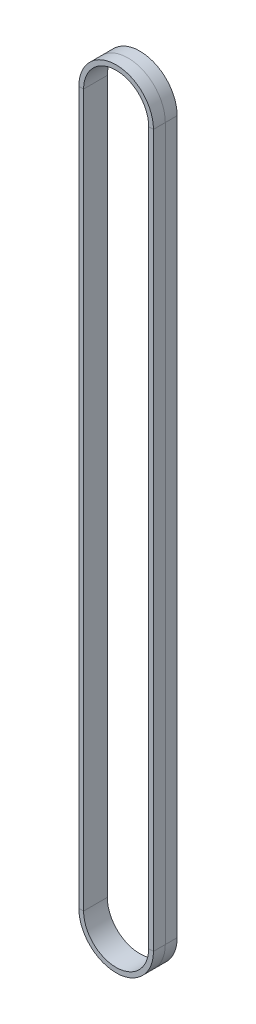
ISO-10303-21;
HEADER;
FILE_DESCRIPTION(('STEP AP214'),'2;1');
FILE_NAME('part.step','',(''),(''),'','','');
FILE_SCHEMA(('AUTOMOTIVE_DESIGN { 1 0 10303 214 1 1 1 1 }'));
ENDSEC;
DATA;
#1=APPLICATION_CONTEXT('core data for automotive mechanical design processes');
#2=APPLICATION_PROTOCOL_DEFINITION('international standard','automotive_design',2000,#1);
#3=PRODUCT_CONTEXT('',#1,'mechanical');
#4=PRODUCT('Part','Part','',(#3));
#5=PRODUCT_RELATED_PRODUCT_CATEGORY('part','',(#4));
#6=PRODUCT_DEFINITION_FORMATION('','',#4);
#7=PRODUCT_DEFINITION_CONTEXT('part definition',#1,'design');
#8=PRODUCT_DEFINITION('design','',#6,#7);
#9=PRODUCT_DEFINITION_SHAPE('','',#8);
#10=(LENGTH_UNIT() NAMED_UNIT(*) SI_UNIT(.MILLI.,.METRE.));
#11=(NAMED_UNIT(*) PLANE_ANGLE_UNIT() SI_UNIT($,.RADIAN.));
#12=(NAMED_UNIT(*) SI_UNIT($,.STERADIAN.) SOLID_ANGLE_UNIT());
#13=UNCERTAINTY_MEASURE_WITH_UNIT(LENGTH_MEASURE(1.E-05),#10,'distance_accuracy_value','');
#14=(GEOMETRIC_REPRESENTATION_CONTEXT(3) GLOBAL_UNCERTAINTY_ASSIGNED_CONTEXT((#13)) GLOBAL_UNIT_ASSIGNED_CONTEXT((#10,
#11,#12)) REPRESENTATION_CONTEXT('',''));
#15=CARTESIAN_POINT('',(0.,0.,0.));
#16=DIRECTION('',(0.,0.,1.));
#17=DIRECTION('',(1.,0.,0.));
#18=AXIS2_PLACEMENT_3D('',#15,#16,#17);
#19=CARTESIAN_POINT('',(-13.9450000000017,300.000000000021,-5.));
#20=DIRECTION('',(0.,0.,1.));
#21=DIRECTION('',(1.,0.,0.));
#22=AXIS2_PLACEMENT_3D('',#19,#20,#21);
#23=PLANE('',#22);
#24=DIRECTION('',(-1.,0.,0.));
#25=VECTOR('',#24,1.);
#26=CARTESIAN_POINT('',(-13.9450000000017,300.000000000021,-5.));
#27=LINE('',#26,#25);
#28=CARTESIAN_POINT('',(-13.9450000000017,300.000000000021,-5.));
#29=VERTEX_POINT('',#28);
#30=CARTESIAN_POINT('',(-15.9450000000017,300.000000000021,-5.));
#31=VERTEX_POINT('',#30);
#32=EDGE_CURVE('E167',#29,#31,#27,.T.);
#33=ORIENTED_EDGE('',*,*,#32,.F.);
#34=DIRECTION('',(0.,-1.,0.));
#35=VECTOR('',#34,1.);
#36=CARTESIAN_POINT('',(-13.9450000000017,300.000000000021,-5.));
#37=LINE('',#36,#35);
#38=CARTESIAN_POINT('',(-13.945,0.,-5.));
#39=VERTEX_POINT('',#38);
#40=EDGE_CURVE('E166',#29,#39,#37,.T.);
#41=ORIENTED_EDGE('',*,*,#40,.T.);
#42=DIRECTION('',(-1.,0.,0.));
#43=VECTOR('',#42,1.);
#44=CARTESIAN_POINT('',(-13.945,0.,-5.));
#45=LINE('',#44,#43);
#46=CARTESIAN_POINT('',(-15.945,0.,-5.));
#47=VERTEX_POINT('',#46);
#48=EDGE_CURVE('E146',#39,#47,#45,.T.);
#49=ORIENTED_EDGE('',*,*,#48,.T.);
#50=DIRECTION('',(0.,-1.,0.));
#51=VECTOR('',#50,1.);
#52=CARTESIAN_POINT('',(-15.9450000000017,300.000000000021,-5.));
#53=LINE('',#52,#51);
#54=EDGE_CURVE('E171',#31,#47,#53,.T.);
#55=ORIENTED_EDGE('',*,*,#54,.F.);
#56=EDGE_LOOP('',(#33,#41,#49,#55));
#57=FACE_BOUND('',#56,.T.);
#58=ADVANCED_FACE('F34',(#57),#23,.F.);
#59=CARTESIAN_POINT('',(-13.945,0.,-5.));
#60=DIRECTION('',(0.,0.,1.));
#61=DIRECTION('',(1.,0.,0.));
#62=AXIS2_PLACEMENT_3D('',#59,#60,#61);
#63=PLANE('',#62);
#64=CARTESIAN_POINT('',(-29.6645400780617,2.91433543964104E-13,-5.));
#65=DIRECTION('',(0.,0.,-1.));
#66=DIRECTION('',(1.,0.,0.));
#67=AXIS2_PLACEMENT_3D('',#64,#65,#66);
#68=CIRCLE('',#67,13.7195400780617);
#69=CARTESIAN_POINT('',(-43.3840801561233,5.8118692884397E-13,-5.));
#70=VERTEX_POINT('',#69);
#71=EDGE_CURVE('E129',#47,#70,#68,.T.);
#72=ORIENTED_EDGE('',*,*,#71,.F.);
#73=ORIENTED_EDGE('',*,*,#48,.F.);
#74=CARTESIAN_POINT('',(-29.6645400780617,2.91433543964104E-13,-5.));
#75=DIRECTION('',(0.,0.,-1.));
#76=DIRECTION('',(1.,0.,0.));
#77=AXIS2_PLACEMENT_3D('',#74,#75,#76);
#78=CIRCLE('',#77,15.7195400780617);
#79=CARTESIAN_POINT('',(-45.3840801561233,5.80941999484141E-13,-5.));
#80=VERTEX_POINT('',#79);
#81=EDGE_CURVE('E151',#39,#80,#78,.T.);
#82=ORIENTED_EDGE('',*,*,#81,.T.);
#83=DIRECTION('',(1.,0.,0.));
#84=VECTOR('',#83,1.);
#85=CARTESIAN_POINT('',(-45.3840801561233,5.84792176372274E-13,-5.));
#86=LINE('',#85,#84);
#87=EDGE_CURVE('E163',#80,#70,#86,.T.);
#88=ORIENTED_EDGE('',*,*,#87,.T.);
#89=EDGE_LOOP('',(#72,#73,#82,#88));
#90=FACE_BOUND('',#89,.T.);
#91=ADVANCED_FACE('F150',(#90),#63,.F.);
#92=CARTESIAN_POINT('',(-29.6645400780617,2.91433543964104E-13,0.));
#93=DIRECTION('',(0.,0.,-1.));
#94=DIRECTION('',(-1.,0.,0.));
#95=AXIS2_PLACEMENT_3D('',#92,#93,#94);
#96=CYLINDRICAL_SURFACE('',#95,13.7195400780617);
#97=CARTESIAN_POINT('',(-29.6645400780617,2.91433543964104E-13,5.));
#98=DIRECTION('',(0.,0.,-1.));
#99=DIRECTION('',(1.,0.,0.));
#100=AXIS2_PLACEMENT_3D('',#97,#98,#99);
#101=CIRCLE('',#100,13.7195400780617);
#102=CARTESIAN_POINT('',(-15.945,0.,5.));
#103=VERTEX_POINT('',#102);
#104=CARTESIAN_POINT('',(-43.3840801561233,5.8118692884397E-13,5.));
#105=VERTEX_POINT('',#104);
#106=EDGE_CURVE('E122',#103,#105,#101,.T.);
#107=ORIENTED_EDGE('',*,*,#106,.F.);
#108=DIRECTION('',(0.,0.,1.));
#109=VECTOR('',#108,1.);
#110=CARTESIAN_POINT('',(-15.945,0.,-5.));
#111=LINE('',#110,#109);
#112=EDGE_CURVE('E153',#47,#103,#111,.T.);
#113=ORIENTED_EDGE('',*,*,#112,.F.);
#114=ORIENTED_EDGE('',*,*,#71,.T.);
#115=DIRECTION('',(0.,0.,1.));
#116=VECTOR('',#115,1.);
#117=CARTESIAN_POINT('',(-43.3840801561233,5.84547247012444E-13,-5.));
#118=LINE('',#117,#116);
#119=EDGE_CURVE('E229',#70,#105,#118,.T.);
#120=ORIENTED_EDGE('',*,*,#119,.T.);
#121=EDGE_LOOP('',(#107,#113,#114,#120));
#122=FACE_BOUND('',#121,.T.);
#123=ADVANCED_FACE('F251',(#122),#96,.F.);
#124=CARTESIAN_POINT('',(-15.945,0.,5.));
#125=DIRECTION('',(0.,0.,-1.));
#126=DIRECTION('',(-1.,0.,0.));
#127=AXIS2_PLACEMENT_3D('',#124,#125,#126);
#128=PLANE('',#127);
#129=CARTESIAN_POINT('',(-29.6645400780617,2.91433543964104E-13,5.));
#130=DIRECTION('',(0.,0.,-1.));
#131=DIRECTION('',(1.,0.,0.));
#132=AXIS2_PLACEMENT_3D('',#129,#130,#131);
#133=CIRCLE('',#132,15.7195400780617);
#134=CARTESIAN_POINT('',(-13.945,0.,5.));
#135=VERTEX_POINT('',#134);
#136=CARTESIAN_POINT('',(-45.3840801561233,5.80941999484141E-13,5.));
#137=VERTEX_POINT('',#136);
#138=EDGE_CURVE('E115',#135,#137,#133,.T.);
#139=ORIENTED_EDGE('',*,*,#138,.F.);
#140=DIRECTION('',(1.,0.,0.));
#141=VECTOR('',#140,1.);
#142=CARTESIAN_POINT('',(-15.945,0.,5.));
#143=LINE('',#142,#141);
#144=EDGE_CURVE('E177',#103,#135,#143,.T.);
#145=ORIENTED_EDGE('',*,*,#144,.F.);
#146=ORIENTED_EDGE('',*,*,#106,.T.);
#147=DIRECTION('',(-1.,0.,0.));
#148=VECTOR('',#147,1.);
#149=CARTESIAN_POINT('',(-43.3840801561233,5.84547247012444E-13,5.));
#150=LINE('',#149,#148);
#151=EDGE_CURVE('E213',#105,#137,#150,.T.);
#152=ORIENTED_EDGE('',*,*,#151,.T.);
#153=EDGE_LOOP('',(#139,#145,#146,#152));
#154=FACE_BOUND('',#153,.T.);
#155=ADVANCED_FACE('F253',(#154),#128,.F.);
#156=CARTESIAN_POINT('',(-29.6645400780617,2.91433543964104E-13,0.));
#157=DIRECTION('',(0.,0.,-1.));
#158=DIRECTION('',(-1.,0.,0.));
#159=AXIS2_PLACEMENT_3D('',#156,#157,#158);
#160=CYLINDRICAL_SURFACE('',#159,15.7195400780617);
#161=CARTESIAN_POINT('',(-29.6645400780617,2.91433543964104E-13,0.));
#162=DIRECTION('',(0.,0.,-1.));
#163=DIRECTION('',(1.,0.,0.));
#164=AXIS2_PLACEMENT_3D('',#161,#162,#163);
#165=CIRCLE('',#164,15.7195400780617);
#166=CARTESIAN_POINT('',(-13.945,0.,0.));
#167=VERTEX_POINT('',#166);
#168=CARTESIAN_POINT('',(-45.3840801561233,5.80941999484141E-13,0.));
#169=VERTEX_POINT('',#168);
#170=EDGE_CURVE('E182',#167,#169,#165,.T.);
#171=ORIENTED_EDGE('',*,*,#170,.F.);
#172=DIRECTION('',(0.,0.,-1.));
#173=VECTOR('',#172,1.);
#174=CARTESIAN_POINT('',(-13.945,0.,0.));
#175=LINE('',#174,#173);
#176=EDGE_CURVE('E174',#135,#167,#175,.T.);
#177=ORIENTED_EDGE('',*,*,#176,.F.);
#178=ORIENTED_EDGE('',*,*,#138,.T.);
#179=DIRECTION('',(0.,0.,-1.));
#180=VECTOR('',#179,1.);
#181=CARTESIAN_POINT('',(-45.3840801561233,5.84792176372274E-13,0.));
#182=LINE('',#181,#180);
#183=EDGE_CURVE('E200',#137,#169,#182,.T.);
#184=ORIENTED_EDGE('',*,*,#183,.T.);
#185=EDGE_LOOP('',(#171,#177,#178,#184));
#186=FACE_BOUND('',#185,.T.);
#187=ADVANCED_FACE('F199',(#186),#160,.T.);
#188=CARTESIAN_POINT('',(-29.6645400780617,2.91433543964104E-13,0.));
#189=DIRECTION('',(0.,0.,-1.));
#190=DIRECTION('',(-1.,0.,0.));
#191=AXIS2_PLACEMENT_3D('',#188,#189,#190);
#192=CYLINDRICAL_SURFACE('',#191,15.7195400780617);
#193=DIRECTION('',(0.,0.,-1.));
#194=VECTOR('',#193,1.);
#195=CARTESIAN_POINT('',(-45.3840801561233,5.84792176372274E-13,0.));
#196=LINE('',#195,#194);
#197=EDGE_CURVE('E161',#169,#80,#196,.T.);
#198=ORIENTED_EDGE('',*,*,#197,.T.);
#199=ORIENTED_EDGE('',*,*,#81,.F.);
#200=DIRECTION('',(0.,0.,-1.));
#201=VECTOR('',#200,1.);
#202=CARTESIAN_POINT('',(-13.945,0.,0.));
#203=LINE('',#202,#201);
#204=EDGE_CURVE('E160',#167,#39,#203,.T.);
#205=ORIENTED_EDGE('',*,*,#204,.F.);
#206=ORIENTED_EDGE('',*,*,#170,.T.);
#207=EDGE_LOOP('',(#198,#199,#205,#206));
#208=FACE_BOUND('',#207,.T.);
#209=ADVANCED_FACE('F158',(#208),#192,.T.);
#210=CARTESIAN_POINT('',(-45.3840801561233,5.80574562500578E-13,-5.));
#211=DIRECTION('',(0.,0.,1.));
#212=DIRECTION('',(1.,0.,0.));
#213=AXIS2_PLACEMENT_3D('',#210,#211,#212);
#214=PLANE('',#213);
#215=DIRECTION('',(0.,1.,0.));
#216=VECTOR('',#215,1.);
#217=CARTESIAN_POINT('',(-43.3840801561233,5.80866240935983E-13,-5.));
#218=LINE('',#217,#216);
#219=CARTESIAN_POINT('',(-43.384080156125,300.000000000021,-5.));
#220=VERTEX_POINT('',#219);
#221=EDGE_CURVE('E227',#70,#220,#218,.T.);
#222=ORIENTED_EDGE('',*,*,#221,.F.);
#223=ORIENTED_EDGE('',*,*,#87,.F.);
#224=DIRECTION('',(0.,1.,0.));
#225=VECTOR('',#224,1.);
#226=CARTESIAN_POINT('',(-45.3840801561233,5.80574562500578E-13,-5.));
#227=LINE('',#226,#225);
#228=CARTESIAN_POINT('',(-45.384080156125,300.000000000021,-5.));
#229=VERTEX_POINT('',#228);
#230=EDGE_CURVE('E181',#80,#229,#227,.T.);
#231=ORIENTED_EDGE('',*,*,#230,.T.);
#232=DIRECTION('',(1.,0.,0.));
#233=VECTOR('',#232,1.);
#234=CARTESIAN_POINT('',(-45.384080156125,300.000000000021,-5.));
#235=LINE('',#234,#233);
#236=EDGE_CURVE('E238',#229,#220,#235,.T.);
#237=ORIENTED_EDGE('',*,*,#236,.T.);
#238=EDGE_LOOP('',(#222,#223,#231,#237));
#239=FACE_BOUND('',#238,.T.);
#240=ADVANCED_FACE('F246',(#239),#214,.F.);
#241=CARTESIAN_POINT('',(-43.3840801561233,5.80866240935983E-13,-5.));
#242=DIRECTION('',(-1.,0.,0.));
#243=DIRECTION('',(0.,-1.,0.));
#244=AXIS2_PLACEMENT_3D('',#241,#242,#243);
#245=PLANE('',#244);
#246=DIRECTION('',(0.,1.,0.));
#247=VECTOR('',#246,1.);
#248=CARTESIAN_POINT('',(-43.3840801561233,5.80866240935983E-13,5.));
#249=LINE('',#248,#247);
#250=CARTESIAN_POINT('',(-43.384080156125,300.000000000021,5.));
#251=VERTEX_POINT('',#250);
#252=EDGE_CURVE('E101',#105,#251,#249,.T.);
#253=ORIENTED_EDGE('',*,*,#252,.F.);
#254=ORIENTED_EDGE('',*,*,#119,.F.);
#255=ORIENTED_EDGE('',*,*,#221,.T.);
#256=DIRECTION('',(0.,0.,1.));
#257=VECTOR('',#256,1.);
#258=CARTESIAN_POINT('',(-43.384080156125,300.000000000021,-5.));
#259=LINE('',#258,#257);
#260=EDGE_CURVE('E225',#220,#251,#259,.T.);
#261=ORIENTED_EDGE('',*,*,#260,.T.);
#262=EDGE_LOOP('',(#253,#254,#255,#261));
#263=FACE_BOUND('',#262,.T.);
#264=ADVANCED_FACE('F250',(#263),#245,.F.);
#265=CARTESIAN_POINT('',(-43.3840801561233,5.80866240935983E-13,5.));
#266=DIRECTION('',(0.,0.,-1.));
#267=DIRECTION('',(-1.,0.,0.));
#268=AXIS2_PLACEMENT_3D('',#265,#266,#267);
#269=PLANE('',#268);
#270=DIRECTION('',(0.,1.,0.));
#271=VECTOR('',#270,1.);
#272=CARTESIAN_POINT('',(-45.3840801561233,5.80574562500578E-13,5.));
#273=LINE('',#272,#271);
#274=CARTESIAN_POINT('',(-45.384080156125,300.000000000021,5.));
#275=VERTEX_POINT('',#274);
#276=EDGE_CURVE('E93',#137,#275,#273,.T.);
#277=ORIENTED_EDGE('',*,*,#276,.F.);
#278=ORIENTED_EDGE('',*,*,#151,.F.);
#279=ORIENTED_EDGE('',*,*,#252,.T.);
#280=DIRECTION('',(-1.,0.,0.));
#281=VECTOR('',#280,1.);
#282=CARTESIAN_POINT('',(-43.384080156125,300.000000000021,5.));
#283=LINE('',#282,#281);
#284=EDGE_CURVE('E210',#251,#275,#283,.T.);
#285=ORIENTED_EDGE('',*,*,#284,.T.);
#286=EDGE_LOOP('',(#277,#278,#279,#285));
#287=FACE_BOUND('',#286,.T.);
#288=ADVANCED_FACE('F278',(#287),#269,.F.);
#289=CARTESIAN_POINT('',(-45.3840801561233,5.80574562500578E-13,0.));
#290=DIRECTION('',(1.,0.,0.));
#291=DIRECTION('',(0.,1.,0.));
#292=AXIS2_PLACEMENT_3D('',#289,#290,#291);
#293=PLANE('',#292);
#294=DIRECTION('',(0.,1.,0.));
#295=VECTOR('',#294,1.);
#296=CARTESIAN_POINT('',(-45.3840801561233,5.80574562500578E-13,0.));
#297=LINE('',#296,#295);
#298=CARTESIAN_POINT('',(-45.384080156125,300.000000000021,0.));
#299=VERTEX_POINT('',#298);
#300=EDGE_CURVE('E84',#169,#299,#297,.T.);
#301=ORIENTED_EDGE('',*,*,#300,.F.);
#302=ORIENTED_EDGE('',*,*,#183,.F.);
#303=ORIENTED_EDGE('',*,*,#276,.T.);
#304=DIRECTION('',(0.,0.,-1.));
#305=VECTOR('',#304,1.);
#306=CARTESIAN_POINT('',(-45.384080156125,300.000000000021,0.));
#307=LINE('',#306,#305);
#308=EDGE_CURVE('E187',#275,#299,#307,.T.);
#309=ORIENTED_EDGE('',*,*,#308,.T.);
#310=EDGE_LOOP('',(#301,#302,#303,#309));
#311=FACE_BOUND('',#310,.T.);
#312=ADVANCED_FACE('F288',(#311),#293,.F.);
#313=CARTESIAN_POINT('',(-45.3840801561233,5.80574562500578E-13,0.));
#314=DIRECTION('',(1.,0.,0.));
#315=DIRECTION('',(0.,1.,0.));
#316=AXIS2_PLACEMENT_3D('',#313,#314,#315);
#317=PLANE('',#316);
#318=DIRECTION('',(0.,0.,-1.));
#319=VECTOR('',#318,1.);
#320=CARTESIAN_POINT('',(-45.384080156125,300.000000000021,0.));
#321=LINE('',#320,#319);
#322=EDGE_CURVE('E183',#299,#229,#321,.T.);
#323=ORIENTED_EDGE('',*,*,#322,.T.);
#324=ORIENTED_EDGE('',*,*,#230,.F.);
#325=ORIENTED_EDGE('',*,*,#197,.F.);
#326=ORIENTED_EDGE('',*,*,#300,.T.);
#327=EDGE_LOOP('',(#323,#324,#325,#326));
#328=FACE_BOUND('',#327,.T.);
#329=ADVANCED_FACE('F271',(#328),#317,.F.);
#330=CARTESIAN_POINT('',(-45.384080156125,300.000000000021,-5.));
#331=DIRECTION('',(0.,0.,1.));
#332=DIRECTION('',(1.,0.,0.));
#333=AXIS2_PLACEMENT_3D('',#330,#331,#332);
#334=PLANE('',#333);
#335=CARTESIAN_POINT('',(-29.6645400780633,300.000000000021,-5.));
#336=DIRECTION('',(0.,0.,-1.));
#337=DIRECTION('',(-1.,0.,0.));
#338=AXIS2_PLACEMENT_3D('',#335,#336,#337);
#339=CIRCLE('',#338,13.7195400780617);
#340=EDGE_CURVE('E223',#220,#31,#339,.T.);
#341=ORIENTED_EDGE('',*,*,#340,.F.);
#342=ORIENTED_EDGE('',*,*,#236,.F.);
#343=CARTESIAN_POINT('',(-29.6645400780633,300.000000000021,-5.));
#344=DIRECTION('',(0.,0.,-1.));
#345=DIRECTION('',(-1.,0.,0.));
#346=AXIS2_PLACEMENT_3D('',#343,#344,#345);
#347=CIRCLE('',#346,15.7195400780617);
#348=EDGE_CURVE('E184',#229,#29,#347,.T.);
#349=ORIENTED_EDGE('',*,*,#348,.T.);
#350=ORIENTED_EDGE('',*,*,#32,.T.);
#351=EDGE_LOOP('',(#341,#342,#349,#350));
#352=FACE_BOUND('',#351,.T.);
#353=ADVANCED_FACE('F267',(#352),#334,.F.);
#354=CARTESIAN_POINT('',(-29.6645400780633,300.000000000021,0.));
#355=DIRECTION('',(0.,0.,-1.));
#356=DIRECTION('',(-1.,0.,0.));
#357=AXIS2_PLACEMENT_3D('',#354,#355,#356);
#358=CYLINDRICAL_SURFACE('',#357,13.7195400780617);
#359=CARTESIAN_POINT('',(-29.6645400780633,300.000000000021,5.));
#360=DIRECTION('',(0.,0.,-1.));
#361=DIRECTION('',(-1.,0.,0.));
#362=AXIS2_PLACEMENT_3D('',#359,#360,#361);
#363=CIRCLE('',#362,13.7195400780617);
#364=CARTESIAN_POINT('',(-15.9450000000017,300.000000000021,5.));
#365=VERTEX_POINT('',#364);
#366=EDGE_CURVE('E208',#251,#365,#363,.T.);
#367=ORIENTED_EDGE('',*,*,#366,.F.);
#368=ORIENTED_EDGE('',*,*,#260,.F.);
#369=ORIENTED_EDGE('',*,*,#340,.T.);
#370=DIRECTION('',(0.,0.,1.));
#371=VECTOR('',#370,1.);
#372=CARTESIAN_POINT('',(-15.9450000000017,300.000000000021,-5.));
#373=LINE('',#372,#371);
#374=EDGE_CURVE('E220',#31,#365,#373,.T.);
#375=ORIENTED_EDGE('',*,*,#374,.T.);
#376=EDGE_LOOP('',(#367,#368,#369,#375));
#377=FACE_BOUND('',#376,.T.);
#378=ADVANCED_FACE('F270',(#377),#358,.F.);
#379=CARTESIAN_POINT('',(-43.384080156125,300.000000000021,5.));
#380=DIRECTION('',(0.,0.,-1.));
#381=DIRECTION('',(-1.,0.,0.));
#382=AXIS2_PLACEMENT_3D('',#379,#380,#381);
#383=PLANE('',#382);
#384=CARTESIAN_POINT('',(-29.6645400780633,300.000000000021,5.));
#385=DIRECTION('',(0.,0.,-1.));
#386=DIRECTION('',(-1.,0.,0.));
#387=AXIS2_PLACEMENT_3D('',#384,#385,#386);
#388=CIRCLE('',#387,15.7195400780617);
#389=CARTESIAN_POINT('',(-13.9450000000017,300.000000000021,5.));
#390=VERTEX_POINT('',#389);
#391=EDGE_CURVE('E59',#275,#390,#388,.T.);
#392=ORIENTED_EDGE('',*,*,#391,.F.);
#393=ORIENTED_EDGE('',*,*,#284,.F.);
#394=ORIENTED_EDGE('',*,*,#366,.T.);
#395=DIRECTION('',(1.,0.,0.));
#396=VECTOR('',#395,1.);
#397=CARTESIAN_POINT('',(-15.9450000000017,300.000000000021,5.));
#398=LINE('',#397,#396);
#399=EDGE_CURVE('E206',#365,#390,#398,.T.);
#400=ORIENTED_EDGE('',*,*,#399,.T.);
#401=EDGE_LOOP('',(#392,#393,#394,#400));
#402=FACE_BOUND('',#401,.T.);
#403=ADVANCED_FACE('F299',(#402),#383,.F.);
#404=CARTESIAN_POINT('',(-29.6645400780633,300.000000000021,0.));
#405=DIRECTION('',(0.,0.,-1.));
#406=DIRECTION('',(-1.,0.,0.));
#407=AXIS2_PLACEMENT_3D('',#404,#405,#406);
#408=CYLINDRICAL_SURFACE('',#407,15.7195400780617);
#409=CARTESIAN_POINT('',(-29.6645400780633,300.000000000021,0.));
#410=DIRECTION('',(0.,0.,-1.));
#411=DIRECTION('',(-1.,0.,0.));
#412=AXIS2_PLACEMENT_3D('',#409,#410,#411);
#413=CIRCLE('',#412,15.7195400780617);
#414=CARTESIAN_POINT('',(-13.9450000000017,300.000000000021,0.));
#415=VERTEX_POINT('',#414);
#416=EDGE_CURVE('E51',#299,#415,#413,.T.);
#417=ORIENTED_EDGE('',*,*,#416,.F.);
#418=ORIENTED_EDGE('',*,*,#308,.F.);
#419=ORIENTED_EDGE('',*,*,#391,.T.);
#420=DIRECTION('',(0.,0.,-1.));
#421=VECTOR('',#420,1.);
#422=CARTESIAN_POINT('',(-13.9450000000017,300.000000000021,0.));
#423=LINE('',#422,#421);
#424=EDGE_CURVE('E192',#390,#415,#423,.T.);
#425=ORIENTED_EDGE('',*,*,#424,.T.);
#426=EDGE_LOOP('',(#417,#418,#419,#425));
#427=FACE_BOUND('',#426,.T.);
#428=ADVANCED_FACE('F291',(#427),#408,.T.);
#429=CARTESIAN_POINT('',(-29.6645400780633,300.000000000021,0.));
#430=DIRECTION('',(0.,0.,-1.));
#431=DIRECTION('',(-1.,0.,0.));
#432=AXIS2_PLACEMENT_3D('',#429,#430,#431);
#433=CYLINDRICAL_SURFACE('',#432,15.7195400780617);
#434=DIRECTION('',(0.,0.,-1.));
#435=VECTOR('',#434,1.);
#436=CARTESIAN_POINT('',(-13.9450000000017,300.000000000021,0.));
#437=LINE('',#436,#435);
#438=EDGE_CURVE('E38',#415,#29,#437,.T.);
#439=ORIENTED_EDGE('',*,*,#438,.T.);
#440=ORIENTED_EDGE('',*,*,#348,.F.);
#441=ORIENTED_EDGE('',*,*,#322,.F.);
#442=ORIENTED_EDGE('',*,*,#416,.T.);
#443=EDGE_LOOP('',(#439,#440,#441,#442));
#444=FACE_BOUND('',#443,.T.);
#445=ADVANCED_FACE('F193',(#444),#433,.T.);
#446=CARTESIAN_POINT('',(-15.9450000000017,300.000000000021,-5.));
#447=DIRECTION('',(1.,0.,0.));
#448=DIRECTION('',(0.,1.,0.));
#449=AXIS2_PLACEMENT_3D('',#446,#447,#448);
#450=PLANE('',#449);
#451=ORIENTED_EDGE('',*,*,#54,.T.);
#452=ORIENTED_EDGE('',*,*,#112,.T.);
#453=DIRECTION('',(0.,-1.,0.));
#454=VECTOR('',#453,1.);
#455=CARTESIAN_POINT('',(-15.9450000000017,300.000000000021,5.));
#456=LINE('',#455,#454);
#457=EDGE_CURVE('E204',#365,#103,#456,.T.);
#458=ORIENTED_EDGE('',*,*,#457,.F.);
#459=ORIENTED_EDGE('',*,*,#374,.F.);
#460=EDGE_LOOP('',(#451,#452,#458,#459));
#461=FACE_BOUND('',#460,.T.);
#462=ADVANCED_FACE('F290',(#461),#450,.F.);
#463=CARTESIAN_POINT('',(-15.9450000000017,300.000000000021,5.));
#464=DIRECTION('',(0.,0.,-1.));
#465=DIRECTION('',(-1.,0.,0.));
#466=AXIS2_PLACEMENT_3D('',#463,#464,#465);
#467=PLANE('',#466);
#468=ORIENTED_EDGE('',*,*,#457,.T.);
#469=ORIENTED_EDGE('',*,*,#144,.T.);
#470=DIRECTION('',(0.,-1.,0.));
#471=VECTOR('',#470,1.);
#472=CARTESIAN_POINT('',(-13.9450000000017,300.000000000021,5.));
#473=LINE('',#472,#471);
#474=EDGE_CURVE('E43',#390,#135,#473,.T.);
#475=ORIENTED_EDGE('',*,*,#474,.F.);
#476=ORIENTED_EDGE('',*,*,#399,.F.);
#477=EDGE_LOOP('',(#468,#469,#475,#476));
#478=FACE_BOUND('',#477,.T.);
#479=ADVANCED_FACE('F296',(#478),#467,.F.);
#480=CARTESIAN_POINT('',(-13.9450000000017,300.000000000021,0.));
#481=DIRECTION('',(-1.,0.,0.));
#482=DIRECTION('',(0.,-1.,0.));
#483=AXIS2_PLACEMENT_3D('',#480,#481,#482);
#484=PLANE('',#483);
#485=ORIENTED_EDGE('',*,*,#474,.T.);
#486=ORIENTED_EDGE('',*,*,#176,.T.);
#487=DIRECTION('',(0.,-1.,0.));
#488=VECTOR('',#487,1.);
#489=CARTESIAN_POINT('',(-13.9450000000017,300.000000000021,0.));
#490=LINE('',#489,#488);
#491=EDGE_CURVE('E11',#415,#167,#490,.T.);
#492=ORIENTED_EDGE('',*,*,#491,.F.);
#493=ORIENTED_EDGE('',*,*,#424,.F.);
#494=EDGE_LOOP('',(#485,#486,#492,#493));
#495=FACE_BOUND('',#494,.T.);
#496=ADVANCED_FACE('F197',(#495),#484,.F.);
#497=CARTESIAN_POINT('',(-13.9450000000017,300.000000000021,0.));
#498=DIRECTION('',(-1.,0.,0.));
#499=DIRECTION('',(0.,-1.,0.));
#500=AXIS2_PLACEMENT_3D('',#497,#498,#499);
#501=PLANE('',#500);
#502=ORIENTED_EDGE('',*,*,#491,.T.);
#503=ORIENTED_EDGE('',*,*,#204,.T.);
#504=ORIENTED_EDGE('',*,*,#40,.F.);
#505=ORIENTED_EDGE('',*,*,#438,.F.);
#506=EDGE_LOOP('',(#502,#503,#504,#505));
#507=FACE_BOUND('',#506,.T.);
#508=ADVANCED_FACE('F36',(#507),#501,.F.);
#509=CLOSED_SHELL('',(#58,#91,#123,#155,#187,#209,#240,#264,#288,#312,#329,#353,#378,#403,#428,
#445,#462,#479,#496,#508));
#510=MANIFOLD_SOLID_BREP('B2',#509);
#511=ADVANCED_BREP_SHAPE_REPRESENTATION('',(#18,#510),#14);
#512=SHAPE_DEFINITION_REPRESENTATION(#9,#511);
ENDSEC;
END-ISO-10303-21;
